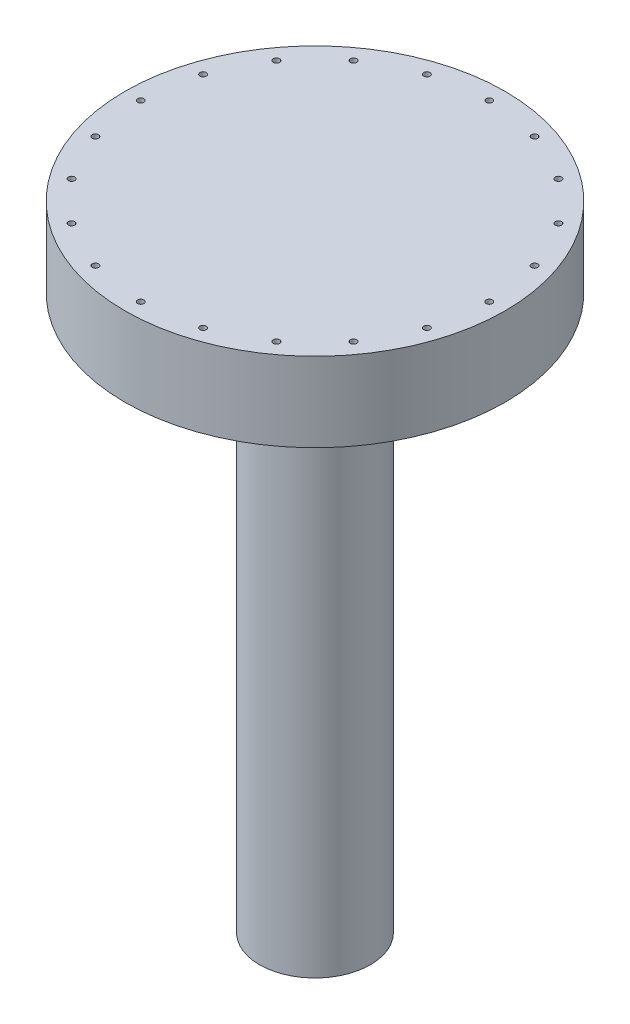
ISO-10303-21;
HEADER;
FILE_DESCRIPTION(('STEP AP214'),'2;1');
FILE_NAME('part.step','',(''),(''),'','','');
FILE_SCHEMA(('AUTOMOTIVE_DESIGN { 1 0 10303 214 1 1 1 1 }'));
ENDSEC;
DATA;
#1=APPLICATION_CONTEXT('core data for automotive mechanical design processes');
#2=APPLICATION_PROTOCOL_DEFINITION('international standard','automotive_design',2000,#1);
#3=PRODUCT_CONTEXT('',#1,'mechanical');
#4=PRODUCT('Part','Part','',(#3));
#5=PRODUCT_RELATED_PRODUCT_CATEGORY('part','',(#4));
#6=PRODUCT_DEFINITION_FORMATION('','',#4);
#7=PRODUCT_DEFINITION_CONTEXT('part definition',#1,'design');
#8=PRODUCT_DEFINITION('design','',#6,#7);
#9=PRODUCT_DEFINITION_SHAPE('','',#8);
#10=(LENGTH_UNIT() NAMED_UNIT(*) SI_UNIT(.MILLI.,.METRE.));
#11=(NAMED_UNIT(*) PLANE_ANGLE_UNIT() SI_UNIT($,.RADIAN.));
#12=(NAMED_UNIT(*) SI_UNIT($,.STERADIAN.) SOLID_ANGLE_UNIT());
#13=UNCERTAINTY_MEASURE_WITH_UNIT(LENGTH_MEASURE(1.E-05),#10,'distance_accuracy_value','');
#14=(GEOMETRIC_REPRESENTATION_CONTEXT(3) GLOBAL_UNCERTAINTY_ASSIGNED_CONTEXT((#13)) GLOBAL_UNIT_ASSIGNED_CONTEXT((#10,
#11,#12)) REPRESENTATION_CONTEXT('',''));
#15=CARTESIAN_POINT('',(0.,0.,0.));
#16=DIRECTION('',(0.,0.,1.));
#17=DIRECTION('',(1.,0.,0.));
#18=AXIS2_PLACEMENT_3D('',#15,#16,#17);
#19=CARTESIAN_POINT('',(0.,35.,0.));
#20=DIRECTION('',(0.,-1.,0.));
#21=DIRECTION('',(0.,0.,-1.));
#22=AXIS2_PLACEMENT_3D('',#19,#20,#21);
#23=CYLINDRICAL_SURFACE('',#22,3.5);
#24=CARTESIAN_POINT('',(0.,35.,0.));
#25=DIRECTION('',(0.,1.,0.));
#26=DIRECTION('',(0.,0.,1.));
#27=AXIS2_PLACEMENT_3D('',#24,#25,#26);
#28=CIRCLE('',#27,3.5);
#29=CARTESIAN_POINT('',(0.,35.,3.5));
#30=VERTEX_POINT('',#29);
#31=EDGE_CURVE('E10',#30,#30,#28,.T.);
#32=ORIENTED_EDGE('',*,*,#31,.F.);
#33=EDGE_LOOP('',(#32));
#34=FACE_BOUND('',#33,.T.);
#35=CARTESIAN_POINT('',(0.,0.,0.));
#36=DIRECTION('',(0.,1.,0.));
#37=DIRECTION('',(0.,0.,1.));
#38=AXIS2_PLACEMENT_3D('',#35,#36,#37);
#39=CIRCLE('',#38,3.5);
#40=CARTESIAN_POINT('',(0.,0.,3.5));
#41=VERTEX_POINT('',#40);
#42=EDGE_CURVE('E34',#41,#41,#39,.T.);
#43=ORIENTED_EDGE('',*,*,#42,.T.);
#44=EDGE_LOOP('',(#43));
#45=FACE_BOUND('',#44,.T.);
#46=ADVANCED_FACE('F31',(#34,#45),#23,.T.);
#47=CARTESIAN_POINT('',(0.,0.,0.));
#48=DIRECTION('',(0.,1.,0.));
#49=DIRECTION('',(0.,0.,1.));
#50=AXIS2_PLACEMENT_3D('',#47,#48,#49);
#51=PLANE('',#50);
#52=ORIENTED_EDGE('',*,*,#42,.F.);
#53=EDGE_LOOP('',(#52));
#54=FACE_BOUND('',#53,.T.);
#55=ADVANCED_FACE('F226',(#54),#51,.F.);
#56=CARTESIAN_POINT('',(0.,40.,0.));
#57=DIRECTION('',(0.,-1.,0.));
#58=DIRECTION('',(0.,0.,-1.));
#59=AXIS2_PLACEMENT_3D('',#56,#57,#58);
#60=CYLINDRICAL_SURFACE('',#59,12.);
#61=CARTESIAN_POINT('',(0.,40.,0.));
#62=DIRECTION('',(0.,1.,0.));
#63=DIRECTION('',(0.,0.,1.));
#64=AXIS2_PLACEMENT_3D('',#61,#62,#63);
#65=CIRCLE('',#64,12.);
#66=CARTESIAN_POINT('',(0.,40.,12.));
#67=VERTEX_POINT('',#66);
#68=EDGE_CURVE('E41',#67,#67,#65,.T.);
#69=ORIENTED_EDGE('',*,*,#68,.F.);
#70=EDGE_LOOP('',(#69));
#71=FACE_BOUND('',#70,.T.);
#72=CARTESIAN_POINT('',(0.,35.,0.));
#73=DIRECTION('',(0.,1.,0.));
#74=DIRECTION('',(0.,0.,1.));
#75=AXIS2_PLACEMENT_3D('',#72,#73,#74);
#76=CIRCLE('',#75,12.);
#77=CARTESIAN_POINT('',(0.,35.,12.));
#78=VERTEX_POINT('',#77);
#79=EDGE_CURVE('E43',#78,#78,#76,.T.);
#80=ORIENTED_EDGE('',*,*,#79,.T.);
#81=EDGE_LOOP('',(#80));
#82=FACE_BOUND('',#81,.T.);
#83=ADVANCED_FACE('F182',(#71,#82),#60,.T.);
#84=CARTESIAN_POINT('',(0.,40.,0.));
#85=DIRECTION('',(0.,1.,0.));
#86=DIRECTION('',(0.,0.,1.));
#87=AXIS2_PLACEMENT_3D('',#84,#85,#86);
#88=PLANE('',#87);
#89=CARTESIAN_POINT('',(-6.46563777521722,40.,-8.89918693812442));
#90=DIRECTION('',(0.,1.,0.));
#91=DIRECTION('',(0.587785252292474,0.,0.809016994374947));
#92=AXIS2_PLACEMENT_3D('',#89,#90,#91);
#93=CIRCLE('',#92,0.2);
#94=CARTESIAN_POINT('',(-6.34808072475872,40.,-8.73738353924943));
#95=VERTEX_POINT('',#94);
#96=EDGE_CURVE('E163',#95,#95,#93,.T.);
#97=ORIENTED_EDGE('',*,*,#96,.F.);
#98=EDGE_LOOP('',(#97));
#99=FACE_BOUND('',#98,.T.);
#100=CARTESIAN_POINT('',(-8.89918693812444,40.,-6.46563777521718));
#101=DIRECTION('',(0.,1.,0.));
#102=DIRECTION('',(0.809016994374949,0.,0.587785252292471));
#103=AXIS2_PLACEMENT_3D('',#100,#101,#102);
#104=CIRCLE('',#103,0.2);
#105=CARTESIAN_POINT('',(-8.73738353924944,40.,-6.34808072475869));
#106=VERTEX_POINT('',#105);
#107=EDGE_CURVE('E157',#106,#106,#104,.T.);
#108=ORIENTED_EDGE('',*,*,#107,.F.);
#109=EDGE_LOOP('',(#108));
#110=FACE_BOUND('',#109,.T.);
#111=CARTESIAN_POINT('',(-10.4616216792467,40.,-3.39918693812439));
#112=DIRECTION('',(0.,1.,0.));
#113=DIRECTION('',(0.951056516295155,0.,0.309016994374945));
#114=AXIS2_PLACEMENT_3D('',#111,#112,#113);
#115=CIRCLE('',#114,0.2);
#116=CARTESIAN_POINT('',(-10.2714103759877,40.,-3.3373835392494));
#117=VERTEX_POINT('',#116);
#118=EDGE_CURVE('E151',#117,#117,#115,.T.);
#119=ORIENTED_EDGE('',*,*,#118,.F.);
#120=EDGE_LOOP('',(#119));
#121=FACE_BOUND('',#120,.T.);
#122=CARTESIAN_POINT('',(-11.,40.,0.));
#123=DIRECTION('',(0.,1.,0.));
#124=DIRECTION('',(1.,0.,0.));
#125=AXIS2_PLACEMENT_3D('',#122,#123,#124);
#126=CIRCLE('',#125,0.2);
#127=CARTESIAN_POINT('',(-10.8,40.,0.));
#128=VERTEX_POINT('',#127);
#129=EDGE_CURVE('E145',#128,#128,#126,.T.);
#130=ORIENTED_EDGE('',*,*,#129,.F.);
#131=EDGE_LOOP('',(#130));
#132=FACE_BOUND('',#131,.T.);
#133=CARTESIAN_POINT('',(-10.4616216792467,40.,3.39918693812447));
#134=DIRECTION('',(0.,1.,0.));
#135=DIRECTION('',(0.951056516295152,0.,-0.309016994374952));
#136=AXIS2_PLACEMENT_3D('',#133,#134,#135);
#137=CIRCLE('',#136,0.2);
#138=CARTESIAN_POINT('',(-10.2714103759876,40.,3.33738353924948));
#139=VERTEX_POINT('',#138);
#140=EDGE_CURVE('E139',#139,#139,#137,.T.);
#141=ORIENTED_EDGE('',*,*,#140,.F.);
#142=EDGE_LOOP('',(#141));
#143=FACE_BOUND('',#142,.T.);
#144=CARTESIAN_POINT('',(-8.89918693812439,40.,6.46563777521725));
#145=DIRECTION('',(0.,1.,0.));
#146=DIRECTION('',(0.809016994374945,0.,-0.587785252292477));
#147=AXIS2_PLACEMENT_3D('',#144,#145,#146);
#148=CIRCLE('',#147,0.2);
#149=CARTESIAN_POINT('',(-8.7373835392494,40.,6.34808072475875));
#150=VERTEX_POINT('',#149);
#151=EDGE_CURVE('E133',#150,#150,#148,.T.);
#152=ORIENTED_EDGE('',*,*,#151,.F.);
#153=EDGE_LOOP('',(#152));
#154=FACE_BOUND('',#153,.T.);
#155=CARTESIAN_POINT('',(-6.46563777521715,40.,8.89918693812446));
#156=DIRECTION('',(0.,1.,0.));
#157=DIRECTION('',(0.587785252292469,0.,-0.809016994374951));
#158=AXIS2_PLACEMENT_3D('',#155,#156,#157);
#159=CIRCLE('',#158,0.2);
#160=CARTESIAN_POINT('',(-6.34808072475866,40.,8.73738353924947));
#161=VERTEX_POINT('',#160);
#162=EDGE_CURVE('E127',#161,#161,#159,.T.);
#163=ORIENTED_EDGE('',*,*,#162,.F.);
#164=EDGE_LOOP('',(#163));
#165=FACE_BOUND('',#164,.T.);
#166=CARTESIAN_POINT('',(-3.39918693812435,40.,10.4616216792467));
#167=DIRECTION('',(0.,1.,0.));
#168=DIRECTION('',(0.309016994374941,0.,-0.951056516295156));
#169=AXIS2_PLACEMENT_3D('',#166,#167,#168);
#170=CIRCLE('',#169,0.2);
#171=CARTESIAN_POINT('',(-3.33738353924936,40.,10.2714103759877));
#172=VERTEX_POINT('',#171);
#173=EDGE_CURVE('E121',#172,#172,#170,.T.);
#174=ORIENTED_EDGE('',*,*,#173,.F.);
#175=EDGE_LOOP('',(#174));
#176=FACE_BOUND('',#175,.T.);
#177=CARTESIAN_POINT('',(0.,40.,11.));
#178=DIRECTION('',(0.,1.,0.));
#179=DIRECTION('',(0.,0.,-1.));
#180=AXIS2_PLACEMENT_3D('',#177,#178,#179);
#181=CIRCLE('',#180,0.2);
#182=CARTESIAN_POINT('',(0.,40.,10.8));
#183=VERTEX_POINT('',#182);
#184=EDGE_CURVE('E115',#183,#183,#181,.T.);
#185=ORIENTED_EDGE('',*,*,#184,.F.);
#186=EDGE_LOOP('',(#185));
#187=FACE_BOUND('',#186,.T.);
#188=CARTESIAN_POINT('',(3.3991869381245,40.,10.4616216792467));
#189=DIRECTION('',(0.,1.,0.));
#190=DIRECTION('',(-0.309016994374955,0.,-0.951056516295151));
#191=AXIS2_PLACEMENT_3D('',#188,#189,#190);
#192=CIRCLE('',#191,0.2);
#193=CARTESIAN_POINT('',(3.33738353924951,40.,10.2714103759876));
#194=VERTEX_POINT('',#193);
#195=EDGE_CURVE('E109',#194,#194,#192,.T.);
#196=ORIENTED_EDGE('',*,*,#195,.F.);
#197=EDGE_LOOP('',(#196));
#198=FACE_BOUND('',#197,.T.);
#199=CARTESIAN_POINT('',(6.46563777521728,40.,8.89918693812436));
#200=DIRECTION('',(0.,1.,0.));
#201=DIRECTION('',(-0.58778525229248,0.,-0.809016994374942));
#202=AXIS2_PLACEMENT_3D('',#199,#200,#201);
#203=CIRCLE('',#202,0.2);
#204=CARTESIAN_POINT('',(6.34808072475879,40.,8.73738353924938));
#205=VERTEX_POINT('',#204);
#206=EDGE_CURVE('E103',#205,#205,#203,.T.);
#207=ORIENTED_EDGE('',*,*,#206,.F.);
#208=EDGE_LOOP('',(#207));
#209=FACE_BOUND('',#208,.T.);
#210=CARTESIAN_POINT('',(8.89918693812449,40.,6.46563777521712));
#211=DIRECTION('',(0.,1.,0.));
#212=DIRECTION('',(-0.809016994374953,0.,-0.587785252292465));
#213=AXIS2_PLACEMENT_3D('',#210,#211,#212);
#214=CIRCLE('',#213,0.2);
#215=CARTESIAN_POINT('',(8.73738353924949,40.,6.34808072475863));
#216=VERTEX_POINT('',#215);
#217=EDGE_CURVE('E97',#216,#216,#214,.T.);
#218=ORIENTED_EDGE('',*,*,#217,.F.);
#219=EDGE_LOOP('',(#218));
#220=FACE_BOUND('',#219,.T.);
#221=CARTESIAN_POINT('',(10.4616216792467,40.,3.39918693812432));
#222=DIRECTION('',(0.,1.,0.));
#223=DIRECTION('',(-0.951056516295157,0.,-0.309016994374938));
#224=AXIS2_PLACEMENT_3D('',#221,#222,#223);
#225=CIRCLE('',#224,0.2);
#226=CARTESIAN_POINT('',(10.2714103759877,40.,3.33738353924933));
#227=VERTEX_POINT('',#226);
#228=EDGE_CURVE('E91',#227,#227,#225,.T.);
#229=ORIENTED_EDGE('',*,*,#228,.F.);
#230=EDGE_LOOP('',(#229));
#231=FACE_BOUND('',#230,.T.);
#232=CARTESIAN_POINT('',(11.,40.,-1.15218884181823E-13));
#233=DIRECTION('',(0.,1.,0.));
#234=DIRECTION('',(-1.,0.,0.));
#235=AXIS2_PLACEMENT_3D('',#232,#233,#234);
#236=CIRCLE('',#235,0.2);
#237=CARTESIAN_POINT('',(10.8,40.,-1.13123995378518E-13));
#238=VERTEX_POINT('',#237);
#239=EDGE_CURVE('E85',#238,#238,#236,.T.);
#240=ORIENTED_EDGE('',*,*,#239,.F.);
#241=EDGE_LOOP('',(#240));
#242=FACE_BOUND('',#241,.T.);
#243=CARTESIAN_POINT('',(10.4616216792467,40.,-3.39918693812454));
#244=DIRECTION('',(0.,1.,0.));
#245=DIRECTION('',(-0.95105651629515,0.,0.309016994374958));
#246=AXIS2_PLACEMENT_3D('',#243,#244,#245);
#247=CIRCLE('',#246,0.2);
#248=CARTESIAN_POINT('',(10.2714103759876,40.,-3.33738353924955));
#249=VERTEX_POINT('',#248);
#250=EDGE_CURVE('E79',#249,#249,#247,.T.);
#251=ORIENTED_EDGE('',*,*,#250,.F.);
#252=EDGE_LOOP('',(#251));
#253=FACE_BOUND('',#252,.T.);
#254=CARTESIAN_POINT('',(8.89918693812434,40.,-6.46563777521731));
#255=DIRECTION('',(0.,1.,0.));
#256=DIRECTION('',(-0.80901699437494,0.,0.587785252292483));
#257=AXIS2_PLACEMENT_3D('',#254,#255,#256);
#258=CIRCLE('',#257,0.2);
#259=CARTESIAN_POINT('',(8.73738353924935,40.,-6.34808072475882));
#260=VERTEX_POINT('',#259);
#261=EDGE_CURVE('E73',#260,#260,#258,.T.);
#262=ORIENTED_EDGE('',*,*,#261,.F.);
#263=EDGE_LOOP('',(#262));
#264=FACE_BOUND('',#263,.T.);
#265=CARTESIAN_POINT('',(6.46563777521709,40.,-8.8991869381245));
#266=DIRECTION('',(0.,1.,0.));
#267=DIRECTION('',(-0.587785252292462,0.,0.809016994374955));
#268=AXIS2_PLACEMENT_3D('',#265,#266,#267);
#269=CIRCLE('',#268,0.2);
#270=CARTESIAN_POINT('',(6.34808072475859,40.,-8.73738353924951));
#271=VERTEX_POINT('',#270);
#272=EDGE_CURVE('E67',#271,#271,#269,.T.);
#273=ORIENTED_EDGE('',*,*,#272,.F.);
#274=EDGE_LOOP('',(#273));
#275=FACE_BOUND('',#274,.T.);
#276=CARTESIAN_POINT('',(3.39918693812428,40.,-10.4616216792467));
#277=DIRECTION('',(0.,1.,0.));
#278=DIRECTION('',(-0.309016994374935,0.,0.951056516295158));
#279=AXIS2_PLACEMENT_3D('',#276,#277,#278);
#280=CIRCLE('',#279,0.2);
#281=CARTESIAN_POINT('',(3.3373835392493,40.,-10.2714103759877));
#282=VERTEX_POINT('',#281);
#283=EDGE_CURVE('E61',#282,#282,#280,.T.);
#284=ORIENTED_EDGE('',*,*,#283,.F.);
#285=EDGE_LOOP('',(#284));
#286=FACE_BOUND('',#285,.T.);
#287=CARTESIAN_POINT('',(-3.39918693812443,40.,-10.4616216792467));
#288=DIRECTION('',(0.,1.,0.));
#289=DIRECTION('',(0.309016994374948,0.,0.951056516295154));
#290=AXIS2_PLACEMENT_3D('',#287,#288,#289);
#291=CIRCLE('',#290,0.2);
#292=CARTESIAN_POINT('',(-3.33738353924944,40.,-10.2714103759877));
#293=VERTEX_POINT('',#292);
#294=EDGE_CURVE('E55',#293,#293,#291,.T.);
#295=ORIENTED_EDGE('',*,*,#294,.F.);
#296=EDGE_LOOP('',(#295));
#297=FACE_BOUND('',#296,.T.);
#298=CARTESIAN_POINT('',(0.,40.,-11.));
#299=DIRECTION('',(0.,1.,0.));
#300=DIRECTION('',(0.,0.,1.));
#301=AXIS2_PLACEMENT_3D('',#298,#299,#300);
#302=CIRCLE('',#301,0.2);
#303=CARTESIAN_POINT('',(0.,40.,-10.8));
#304=VERTEX_POINT('',#303);
#305=EDGE_CURVE('E49',#304,#304,#302,.T.);
#306=ORIENTED_EDGE('',*,*,#305,.F.);
#307=EDGE_LOOP('',(#306));
#308=FACE_BOUND('',#307,.T.);
#309=ORIENTED_EDGE('',*,*,#68,.T.);
#310=EDGE_LOOP('',(#309));
#311=FACE_BOUND('',#310,.T.);
#312=ADVANCED_FACE('F179',(#99,#110,#121,#132,#143,#154,#165,#176,#187,#198,#209,#220,#231,#242,
#253,#264,#275,#286,#297,#308,#311),#88,.T.);
#313=CARTESIAN_POINT('',(0.,35.,0.));
#314=DIRECTION('',(0.,1.,0.));
#315=DIRECTION('',(0.,0.,1.));
#316=AXIS2_PLACEMENT_3D('',#313,#314,#315);
#317=PLANE('',#316);
#318=CARTESIAN_POINT('',(-6.46563777521722,35.,-8.89918693812442));
#319=DIRECTION('',(0.,1.,0.));
#320=DIRECTION('',(0.587785252292474,0.,0.809016994374947));
#321=AXIS2_PLACEMENT_3D('',#318,#319,#320);
#322=CIRCLE('',#321,0.2);
#323=CARTESIAN_POINT('',(-6.34808072475872,35.,-8.73738353924943));
#324=VERTEX_POINT('',#323);
#325=EDGE_CURVE('E58',#324,#324,#322,.T.);
#326=ORIENTED_EDGE('',*,*,#325,.T.);
#327=EDGE_LOOP('',(#326));
#328=FACE_BOUND('',#327,.T.);
#329=CARTESIAN_POINT('',(-8.89918693812444,35.,-6.46563777521718));
#330=DIRECTION('',(0.,1.,0.));
#331=DIRECTION('',(0.809016994374949,0.,0.587785252292471));
#332=AXIS2_PLACEMENT_3D('',#329,#330,#331);
#333=CIRCLE('',#332,0.2);
#334=CARTESIAN_POINT('',(-8.73738353924944,35.,-6.34808072475869));
#335=VERTEX_POINT('',#334);
#336=EDGE_CURVE('E160',#335,#335,#333,.T.);
#337=ORIENTED_EDGE('',*,*,#336,.T.);
#338=EDGE_LOOP('',(#337));
#339=FACE_BOUND('',#338,.T.);
#340=CARTESIAN_POINT('',(-10.4616216792467,35.,-3.39918693812439));
#341=DIRECTION('',(0.,1.,0.));
#342=DIRECTION('',(0.951056516295155,0.,0.309016994374945));
#343=AXIS2_PLACEMENT_3D('',#340,#341,#342);
#344=CIRCLE('',#343,0.2);
#345=CARTESIAN_POINT('',(-10.2714103759877,35.,-3.3373835392494));
#346=VERTEX_POINT('',#345);
#347=EDGE_CURVE('E154',#346,#346,#344,.T.);
#348=ORIENTED_EDGE('',*,*,#347,.T.);
#349=EDGE_LOOP('',(#348));
#350=FACE_BOUND('',#349,.T.);
#351=CARTESIAN_POINT('',(-11.,35.,0.));
#352=DIRECTION('',(0.,1.,0.));
#353=DIRECTION('',(1.,0.,0.));
#354=AXIS2_PLACEMENT_3D('',#351,#352,#353);
#355=CIRCLE('',#354,0.2);
#356=CARTESIAN_POINT('',(-10.8,35.,0.));
#357=VERTEX_POINT('',#356);
#358=EDGE_CURVE('E148',#357,#357,#355,.T.);
#359=ORIENTED_EDGE('',*,*,#358,.T.);
#360=EDGE_LOOP('',(#359));
#361=FACE_BOUND('',#360,.T.);
#362=CARTESIAN_POINT('',(-10.4616216792467,35.,3.39918693812447));
#363=DIRECTION('',(0.,1.,0.));
#364=DIRECTION('',(0.951056516295152,0.,-0.309016994374952));
#365=AXIS2_PLACEMENT_3D('',#362,#363,#364);
#366=CIRCLE('',#365,0.2);
#367=CARTESIAN_POINT('',(-10.2714103759876,35.,3.33738353924948));
#368=VERTEX_POINT('',#367);
#369=EDGE_CURVE('E142',#368,#368,#366,.T.);
#370=ORIENTED_EDGE('',*,*,#369,.T.);
#371=EDGE_LOOP('',(#370));
#372=FACE_BOUND('',#371,.T.);
#373=CARTESIAN_POINT('',(-8.89918693812439,35.,6.46563777521725));
#374=DIRECTION('',(0.,1.,0.));
#375=DIRECTION('',(0.809016994374945,0.,-0.587785252292477));
#376=AXIS2_PLACEMENT_3D('',#373,#374,#375);
#377=CIRCLE('',#376,0.2);
#378=CARTESIAN_POINT('',(-8.7373835392494,35.,6.34808072475875));
#379=VERTEX_POINT('',#378);
#380=EDGE_CURVE('E136',#379,#379,#377,.T.);
#381=ORIENTED_EDGE('',*,*,#380,.T.);
#382=EDGE_LOOP('',(#381));
#383=FACE_BOUND('',#382,.T.);
#384=CARTESIAN_POINT('',(-6.46563777521715,35.,8.89918693812446));
#385=DIRECTION('',(0.,1.,0.));
#386=DIRECTION('',(0.587785252292469,0.,-0.809016994374951));
#387=AXIS2_PLACEMENT_3D('',#384,#385,#386);
#388=CIRCLE('',#387,0.2);
#389=CARTESIAN_POINT('',(-6.34808072475866,35.,8.73738353924947));
#390=VERTEX_POINT('',#389);
#391=EDGE_CURVE('E130',#390,#390,#388,.T.);
#392=ORIENTED_EDGE('',*,*,#391,.T.);
#393=EDGE_LOOP('',(#392));
#394=FACE_BOUND('',#393,.T.);
#395=CARTESIAN_POINT('',(-3.39918693812435,35.,10.4616216792467));
#396=DIRECTION('',(0.,1.,0.));
#397=DIRECTION('',(0.309016994374941,0.,-0.951056516295156));
#398=AXIS2_PLACEMENT_3D('',#395,#396,#397);
#399=CIRCLE('',#398,0.2);
#400=CARTESIAN_POINT('',(-3.33738353924936,35.,10.2714103759877));
#401=VERTEX_POINT('',#400);
#402=EDGE_CURVE('E124',#401,#401,#399,.T.);
#403=ORIENTED_EDGE('',*,*,#402,.T.);
#404=EDGE_LOOP('',(#403));
#405=FACE_BOUND('',#404,.T.);
#406=CARTESIAN_POINT('',(0.,35.,11.));
#407=DIRECTION('',(0.,1.,0.));
#408=DIRECTION('',(0.,0.,-1.));
#409=AXIS2_PLACEMENT_3D('',#406,#407,#408);
#410=CIRCLE('',#409,0.2);
#411=CARTESIAN_POINT('',(0.,35.,10.8));
#412=VERTEX_POINT('',#411);
#413=EDGE_CURVE('E118',#412,#412,#410,.T.);
#414=ORIENTED_EDGE('',*,*,#413,.T.);
#415=EDGE_LOOP('',(#414));
#416=FACE_BOUND('',#415,.T.);
#417=CARTESIAN_POINT('',(3.3991869381245,35.,10.4616216792467));
#418=DIRECTION('',(0.,1.,0.));
#419=DIRECTION('',(-0.309016994374955,0.,-0.951056516295151));
#420=AXIS2_PLACEMENT_3D('',#417,#418,#419);
#421=CIRCLE('',#420,0.2);
#422=CARTESIAN_POINT('',(3.33738353924951,35.,10.2714103759876));
#423=VERTEX_POINT('',#422);
#424=EDGE_CURVE('E112',#423,#423,#421,.T.);
#425=ORIENTED_EDGE('',*,*,#424,.T.);
#426=EDGE_LOOP('',(#425));
#427=FACE_BOUND('',#426,.T.);
#428=CARTESIAN_POINT('',(6.46563777521728,35.,8.89918693812436));
#429=DIRECTION('',(0.,1.,0.));
#430=DIRECTION('',(-0.58778525229248,0.,-0.809016994374942));
#431=AXIS2_PLACEMENT_3D('',#428,#429,#430);
#432=CIRCLE('',#431,0.2);
#433=CARTESIAN_POINT('',(6.34808072475879,35.,8.73738353924938));
#434=VERTEX_POINT('',#433);
#435=EDGE_CURVE('E106',#434,#434,#432,.T.);
#436=ORIENTED_EDGE('',*,*,#435,.T.);
#437=EDGE_LOOP('',(#436));
#438=FACE_BOUND('',#437,.T.);
#439=CARTESIAN_POINT('',(8.89918693812449,35.,6.46563777521712));
#440=DIRECTION('',(0.,1.,0.));
#441=DIRECTION('',(-0.809016994374953,0.,-0.587785252292465));
#442=AXIS2_PLACEMENT_3D('',#439,#440,#441);
#443=CIRCLE('',#442,0.2);
#444=CARTESIAN_POINT('',(8.73738353924949,35.,6.34808072475863));
#445=VERTEX_POINT('',#444);
#446=EDGE_CURVE('E100',#445,#445,#443,.T.);
#447=ORIENTED_EDGE('',*,*,#446,.T.);
#448=EDGE_LOOP('',(#447));
#449=FACE_BOUND('',#448,.T.);
#450=CARTESIAN_POINT('',(10.4616216792467,35.,3.39918693812432));
#451=DIRECTION('',(0.,1.,0.));
#452=DIRECTION('',(-0.951056516295157,0.,-0.309016994374938));
#453=AXIS2_PLACEMENT_3D('',#450,#451,#452);
#454=CIRCLE('',#453,0.2);
#455=CARTESIAN_POINT('',(10.2714103759877,35.,3.33738353924933));
#456=VERTEX_POINT('',#455);
#457=EDGE_CURVE('E94',#456,#456,#454,.T.);
#458=ORIENTED_EDGE('',*,*,#457,.T.);
#459=EDGE_LOOP('',(#458));
#460=FACE_BOUND('',#459,.T.);
#461=CARTESIAN_POINT('',(11.,35.,-1.15218884181823E-13));
#462=DIRECTION('',(0.,1.,0.));
#463=DIRECTION('',(-1.,0.,0.));
#464=AXIS2_PLACEMENT_3D('',#461,#462,#463);
#465=CIRCLE('',#464,0.2);
#466=CARTESIAN_POINT('',(10.8,35.,-1.13123995378518E-13));
#467=VERTEX_POINT('',#466);
#468=EDGE_CURVE('E88',#467,#467,#465,.T.);
#469=ORIENTED_EDGE('',*,*,#468,.T.);
#470=EDGE_LOOP('',(#469));
#471=FACE_BOUND('',#470,.T.);
#472=CARTESIAN_POINT('',(10.4616216792467,35.,-3.39918693812454));
#473=DIRECTION('',(0.,1.,0.));
#474=DIRECTION('',(-0.95105651629515,0.,0.309016994374958));
#475=AXIS2_PLACEMENT_3D('',#472,#473,#474);
#476=CIRCLE('',#475,0.2);
#477=CARTESIAN_POINT('',(10.2714103759876,35.,-3.33738353924955));
#478=VERTEX_POINT('',#477);
#479=EDGE_CURVE('E82',#478,#478,#476,.T.);
#480=ORIENTED_EDGE('',*,*,#479,.T.);
#481=EDGE_LOOP('',(#480));
#482=FACE_BOUND('',#481,.T.);
#483=CARTESIAN_POINT('',(8.89918693812434,35.,-6.46563777521731));
#484=DIRECTION('',(0.,1.,0.));
#485=DIRECTION('',(-0.80901699437494,0.,0.587785252292483));
#486=AXIS2_PLACEMENT_3D('',#483,#484,#485);
#487=CIRCLE('',#486,0.2);
#488=CARTESIAN_POINT('',(8.73738353924935,35.,-6.34808072475882));
#489=VERTEX_POINT('',#488);
#490=EDGE_CURVE('E76',#489,#489,#487,.T.);
#491=ORIENTED_EDGE('',*,*,#490,.T.);
#492=EDGE_LOOP('',(#491));
#493=FACE_BOUND('',#492,.T.);
#494=CARTESIAN_POINT('',(6.46563777521709,35.,-8.8991869381245));
#495=DIRECTION('',(0.,1.,0.));
#496=DIRECTION('',(-0.587785252292462,0.,0.809016994374955));
#497=AXIS2_PLACEMENT_3D('',#494,#495,#496);
#498=CIRCLE('',#497,0.2);
#499=CARTESIAN_POINT('',(6.34808072475859,35.,-8.73738353924951));
#500=VERTEX_POINT('',#499);
#501=EDGE_CURVE('E70',#500,#500,#498,.T.);
#502=ORIENTED_EDGE('',*,*,#501,.T.);
#503=EDGE_LOOP('',(#502));
#504=FACE_BOUND('',#503,.T.);
#505=CARTESIAN_POINT('',(3.39918693812428,35.,-10.4616216792467));
#506=DIRECTION('',(0.,1.,0.));
#507=DIRECTION('',(-0.309016994374935,0.,0.951056516295158));
#508=AXIS2_PLACEMENT_3D('',#505,#506,#507);
#509=CIRCLE('',#508,0.2);
#510=CARTESIAN_POINT('',(3.3373835392493,35.,-10.2714103759877));
#511=VERTEX_POINT('',#510);
#512=EDGE_CURVE('E64',#511,#511,#509,.T.);
#513=ORIENTED_EDGE('',*,*,#512,.T.);
#514=EDGE_LOOP('',(#513));
#515=FACE_BOUND('',#514,.T.);
#516=CARTESIAN_POINT('',(-3.39918693812443,35.,-10.4616216792467));
#517=DIRECTION('',(0.,1.,0.));
#518=DIRECTION('',(0.309016994374948,0.,0.951056516295154));
#519=AXIS2_PLACEMENT_3D('',#516,#517,#518);
#520=CIRCLE('',#519,0.2);
#521=CARTESIAN_POINT('',(-3.33738353924944,35.,-10.2714103759877));
#522=VERTEX_POINT('',#521);
#523=EDGE_CURVE('E52',#522,#522,#520,.T.);
#524=ORIENTED_EDGE('',*,*,#523,.T.);
#525=EDGE_LOOP('',(#524));
#526=FACE_BOUND('',#525,.T.);
#527=CARTESIAN_POINT('',(0.,35.,-11.));
#528=DIRECTION('',(0.,1.,0.));
#529=DIRECTION('',(0.,0.,1.));
#530=AXIS2_PLACEMENT_3D('',#527,#528,#529);
#531=CIRCLE('',#530,0.2);
#532=CARTESIAN_POINT('',(0.,35.,-10.8));
#533=VERTEX_POINT('',#532);
#534=EDGE_CURVE('E46',#533,#533,#531,.T.);
#535=ORIENTED_EDGE('',*,*,#534,.T.);
#536=EDGE_LOOP('',(#535));
#537=FACE_BOUND('',#536,.T.);
#538=ORIENTED_EDGE('',*,*,#31,.T.);
#539=EDGE_LOOP('',(#538));
#540=FACE_BOUND('',#539,.T.);
#541=ORIENTED_EDGE('',*,*,#79,.F.);
#542=EDGE_LOOP('',(#541));
#543=FACE_BOUND('',#542,.T.);
#544=ADVANCED_FACE('F169',(#328,#339,#350,#361,#372,#383,#394,#405,#416,#427,#438,#449,#460,
#471,#482,#493,#504,#515,#526,#537,#540,#543),#317,.F.);
#545=CARTESIAN_POINT('',(0.,35.,-11.));
#546=DIRECTION('',(0.,1.,0.));
#547=DIRECTION('',(0.,0.,1.));
#548=AXIS2_PLACEMENT_3D('',#545,#546,#547);
#549=CYLINDRICAL_SURFACE('',#548,0.2);
#550=ORIENTED_EDGE('',*,*,#534,.F.);
#551=EDGE_LOOP('',(#550));
#552=FACE_BOUND('',#551,.T.);
#553=ORIENTED_EDGE('',*,*,#305,.T.);
#554=EDGE_LOOP('',(#553));
#555=FACE_BOUND('',#554,.T.);
#556=ADVANCED_FACE('F231',(#552,#555),#549,.F.);
#557=CARTESIAN_POINT('',(-3.39918693812443,35.,-10.4616216792467));
#558=DIRECTION('',(0.,1.,0.));
#559=DIRECTION('',(0.,0.,1.));
#560=AXIS2_PLACEMENT_3D('',#557,#558,#559);
#561=CYLINDRICAL_SURFACE('',#560,0.2);
#562=ORIENTED_EDGE('',*,*,#523,.F.);
#563=EDGE_LOOP('',(#562));
#564=FACE_BOUND('',#563,.T.);
#565=ORIENTED_EDGE('',*,*,#294,.T.);
#566=EDGE_LOOP('',(#565));
#567=FACE_BOUND('',#566,.T.);
#568=ADVANCED_FACE('F236',(#564,#567),#561,.F.);
#569=CARTESIAN_POINT('',(3.39918693812428,35.,-10.4616216792467));
#570=DIRECTION('',(0.,1.,0.));
#571=DIRECTION('',(0.,0.,1.));
#572=AXIS2_PLACEMENT_3D('',#569,#570,#571);
#573=CYLINDRICAL_SURFACE('',#572,0.2);
#574=ORIENTED_EDGE('',*,*,#512,.F.);
#575=EDGE_LOOP('',(#574));
#576=FACE_BOUND('',#575,.T.);
#577=ORIENTED_EDGE('',*,*,#283,.T.);
#578=EDGE_LOOP('',(#577));
#579=FACE_BOUND('',#578,.T.);
#580=ADVANCED_FACE('F273',(#576,#579),#573,.F.);
#581=CARTESIAN_POINT('',(6.46563777521709,35.,-8.8991869381245));
#582=DIRECTION('',(0.,1.,0.));
#583=DIRECTION('',(0.,0.,1.));
#584=AXIS2_PLACEMENT_3D('',#581,#582,#583);
#585=CYLINDRICAL_SURFACE('',#584,0.2);
#586=ORIENTED_EDGE('',*,*,#501,.F.);
#587=EDGE_LOOP('',(#586));
#588=FACE_BOUND('',#587,.T.);
#589=ORIENTED_EDGE('',*,*,#272,.T.);
#590=EDGE_LOOP('',(#589));
#591=FACE_BOUND('',#590,.T.);
#592=ADVANCED_FACE('F283',(#588,#591),#585,.F.);
#593=CARTESIAN_POINT('',(8.89918693812434,35.,-6.46563777521731));
#594=DIRECTION('',(0.,1.,0.));
#595=DIRECTION('',(0.,0.,1.));
#596=AXIS2_PLACEMENT_3D('',#593,#594,#595);
#597=CYLINDRICAL_SURFACE('',#596,0.2);
#598=ORIENTED_EDGE('',*,*,#490,.F.);
#599=EDGE_LOOP('',(#598));
#600=FACE_BOUND('',#599,.T.);
#601=ORIENTED_EDGE('',*,*,#261,.T.);
#602=EDGE_LOOP('',(#601));
#603=FACE_BOUND('',#602,.T.);
#604=ADVANCED_FACE('F293',(#600,#603),#597,.F.);
#605=CARTESIAN_POINT('',(10.4616216792467,35.,-3.39918693812454));
#606=DIRECTION('',(0.,1.,0.));
#607=DIRECTION('',(0.,0.,1.));
#608=AXIS2_PLACEMENT_3D('',#605,#606,#607);
#609=CYLINDRICAL_SURFACE('',#608,0.2);
#610=ORIENTED_EDGE('',*,*,#479,.F.);
#611=EDGE_LOOP('',(#610));
#612=FACE_BOUND('',#611,.T.);
#613=ORIENTED_EDGE('',*,*,#250,.T.);
#614=EDGE_LOOP('',(#613));
#615=FACE_BOUND('',#614,.T.);
#616=ADVANCED_FACE('F303',(#612,#615),#609,.F.);
#617=CARTESIAN_POINT('',(11.,35.,-1.15218884181823E-13));
#618=DIRECTION('',(0.,1.,0.));
#619=DIRECTION('',(0.,0.,1.));
#620=AXIS2_PLACEMENT_3D('',#617,#618,#619);
#621=CYLINDRICAL_SURFACE('',#620,0.2);
#622=ORIENTED_EDGE('',*,*,#468,.F.);
#623=EDGE_LOOP('',(#622));
#624=FACE_BOUND('',#623,.T.);
#625=ORIENTED_EDGE('',*,*,#239,.T.);
#626=EDGE_LOOP('',(#625));
#627=FACE_BOUND('',#626,.T.);
#628=ADVANCED_FACE('F313',(#624,#627),#621,.F.);
#629=CARTESIAN_POINT('',(10.4616216792467,35.,3.39918693812432));
#630=DIRECTION('',(0.,1.,0.));
#631=DIRECTION('',(0.,0.,1.));
#632=AXIS2_PLACEMENT_3D('',#629,#630,#631);
#633=CYLINDRICAL_SURFACE('',#632,0.2);
#634=ORIENTED_EDGE('',*,*,#457,.F.);
#635=EDGE_LOOP('',(#634));
#636=FACE_BOUND('',#635,.T.);
#637=ORIENTED_EDGE('',*,*,#228,.T.);
#638=EDGE_LOOP('',(#637));
#639=FACE_BOUND('',#638,.T.);
#640=ADVANCED_FACE('F323',(#636,#639),#633,.F.);
#641=CARTESIAN_POINT('',(8.89918693812449,35.,6.46563777521712));
#642=DIRECTION('',(0.,1.,0.));
#643=DIRECTION('',(0.,0.,1.));
#644=AXIS2_PLACEMENT_3D('',#641,#642,#643);
#645=CYLINDRICAL_SURFACE('',#644,0.2);
#646=ORIENTED_EDGE('',*,*,#446,.F.);
#647=EDGE_LOOP('',(#646));
#648=FACE_BOUND('',#647,.T.);
#649=ORIENTED_EDGE('',*,*,#217,.T.);
#650=EDGE_LOOP('',(#649));
#651=FACE_BOUND('',#650,.T.);
#652=ADVANCED_FACE('F333',(#648,#651),#645,.F.);
#653=CARTESIAN_POINT('',(6.46563777521728,35.,8.89918693812436));
#654=DIRECTION('',(0.,1.,0.));
#655=DIRECTION('',(0.,0.,1.));
#656=AXIS2_PLACEMENT_3D('',#653,#654,#655);
#657=CYLINDRICAL_SURFACE('',#656,0.2);
#658=ORIENTED_EDGE('',*,*,#435,.F.);
#659=EDGE_LOOP('',(#658));
#660=FACE_BOUND('',#659,.T.);
#661=ORIENTED_EDGE('',*,*,#206,.T.);
#662=EDGE_LOOP('',(#661));
#663=FACE_BOUND('',#662,.T.);
#664=ADVANCED_FACE('F343',(#660,#663),#657,.F.);
#665=CARTESIAN_POINT('',(3.3991869381245,35.,10.4616216792467));
#666=DIRECTION('',(0.,1.,0.));
#667=DIRECTION('',(0.,0.,1.));
#668=AXIS2_PLACEMENT_3D('',#665,#666,#667);
#669=CYLINDRICAL_SURFACE('',#668,0.2);
#670=ORIENTED_EDGE('',*,*,#424,.F.);
#671=EDGE_LOOP('',(#670));
#672=FACE_BOUND('',#671,.T.);
#673=ORIENTED_EDGE('',*,*,#195,.T.);
#674=EDGE_LOOP('',(#673));
#675=FACE_BOUND('',#674,.T.);
#676=ADVANCED_FACE('F353',(#672,#675),#669,.F.);
#677=CARTESIAN_POINT('',(0.,35.,11.));
#678=DIRECTION('',(0.,1.,0.));
#679=DIRECTION('',(0.,0.,1.));
#680=AXIS2_PLACEMENT_3D('',#677,#678,#679);
#681=CYLINDRICAL_SURFACE('',#680,0.2);
#682=ORIENTED_EDGE('',*,*,#413,.F.);
#683=EDGE_LOOP('',(#682));
#684=FACE_BOUND('',#683,.T.);
#685=ORIENTED_EDGE('',*,*,#184,.T.);
#686=EDGE_LOOP('',(#685));
#687=FACE_BOUND('',#686,.T.);
#688=ADVANCED_FACE('F363',(#684,#687),#681,.F.);
#689=CARTESIAN_POINT('',(-3.39918693812435,35.,10.4616216792467));
#690=DIRECTION('',(0.,1.,0.));
#691=DIRECTION('',(0.,0.,1.));
#692=AXIS2_PLACEMENT_3D('',#689,#690,#691);
#693=CYLINDRICAL_SURFACE('',#692,0.2);
#694=ORIENTED_EDGE('',*,*,#402,.F.);
#695=EDGE_LOOP('',(#694));
#696=FACE_BOUND('',#695,.T.);
#697=ORIENTED_EDGE('',*,*,#173,.T.);
#698=EDGE_LOOP('',(#697));
#699=FACE_BOUND('',#698,.T.);
#700=ADVANCED_FACE('F373',(#696,#699),#693,.F.);
#701=CARTESIAN_POINT('',(-6.46563777521715,35.,8.89918693812446));
#702=DIRECTION('',(0.,1.,0.));
#703=DIRECTION('',(0.,0.,1.));
#704=AXIS2_PLACEMENT_3D('',#701,#702,#703);
#705=CYLINDRICAL_SURFACE('',#704,0.2);
#706=ORIENTED_EDGE('',*,*,#391,.F.);
#707=EDGE_LOOP('',(#706));
#708=FACE_BOUND('',#707,.T.);
#709=ORIENTED_EDGE('',*,*,#162,.T.);
#710=EDGE_LOOP('',(#709));
#711=FACE_BOUND('',#710,.T.);
#712=ADVANCED_FACE('F383',(#708,#711),#705,.F.);
#713=CARTESIAN_POINT('',(-8.89918693812439,35.,6.46563777521725));
#714=DIRECTION('',(0.,1.,0.));
#715=DIRECTION('',(0.,0.,1.));
#716=AXIS2_PLACEMENT_3D('',#713,#714,#715);
#717=CYLINDRICAL_SURFACE('',#716,0.2);
#718=ORIENTED_EDGE('',*,*,#380,.F.);
#719=EDGE_LOOP('',(#718));
#720=FACE_BOUND('',#719,.T.);
#721=ORIENTED_EDGE('',*,*,#151,.T.);
#722=EDGE_LOOP('',(#721));
#723=FACE_BOUND('',#722,.T.);
#724=ADVANCED_FACE('F393',(#720,#723),#717,.F.);
#725=CARTESIAN_POINT('',(-10.4616216792467,35.,3.39918693812447));
#726=DIRECTION('',(0.,1.,0.));
#727=DIRECTION('',(0.,0.,1.));
#728=AXIS2_PLACEMENT_3D('',#725,#726,#727);
#729=CYLINDRICAL_SURFACE('',#728,0.2);
#730=ORIENTED_EDGE('',*,*,#369,.F.);
#731=EDGE_LOOP('',(#730));
#732=FACE_BOUND('',#731,.T.);
#733=ORIENTED_EDGE('',*,*,#140,.T.);
#734=EDGE_LOOP('',(#733));
#735=FACE_BOUND('',#734,.T.);
#736=ADVANCED_FACE('F403',(#732,#735),#729,.F.);
#737=CARTESIAN_POINT('',(-11.,35.,0.));
#738=DIRECTION('',(0.,1.,0.));
#739=DIRECTION('',(0.,0.,1.));
#740=AXIS2_PLACEMENT_3D('',#737,#738,#739);
#741=CYLINDRICAL_SURFACE('',#740,0.2);
#742=ORIENTED_EDGE('',*,*,#358,.F.);
#743=EDGE_LOOP('',(#742));
#744=FACE_BOUND('',#743,.T.);
#745=ORIENTED_EDGE('',*,*,#129,.T.);
#746=EDGE_LOOP('',(#745));
#747=FACE_BOUND('',#746,.T.);
#748=ADVANCED_FACE('F413',(#744,#747),#741,.F.);
#749=CARTESIAN_POINT('',(-10.4616216792467,35.,-3.39918693812439));
#750=DIRECTION('',(0.,1.,0.));
#751=DIRECTION('',(0.,0.,1.));
#752=AXIS2_PLACEMENT_3D('',#749,#750,#751);
#753=CYLINDRICAL_SURFACE('',#752,0.2);
#754=ORIENTED_EDGE('',*,*,#347,.F.);
#755=EDGE_LOOP('',(#754));
#756=FACE_BOUND('',#755,.T.);
#757=ORIENTED_EDGE('',*,*,#118,.T.);
#758=EDGE_LOOP('',(#757));
#759=FACE_BOUND('',#758,.T.);
#760=ADVANCED_FACE('F423',(#756,#759),#753,.F.);
#761=CARTESIAN_POINT('',(-8.89918693812444,35.,-6.46563777521718));
#762=DIRECTION('',(0.,1.,0.));
#763=DIRECTION('',(0.,0.,1.));
#764=AXIS2_PLACEMENT_3D('',#761,#762,#763);
#765=CYLINDRICAL_SURFACE('',#764,0.2);
#766=ORIENTED_EDGE('',*,*,#336,.F.);
#767=EDGE_LOOP('',(#766));
#768=FACE_BOUND('',#767,.T.);
#769=ORIENTED_EDGE('',*,*,#107,.T.);
#770=EDGE_LOOP('',(#769));
#771=FACE_BOUND('',#770,.T.);
#772=ADVANCED_FACE('F175',(#768,#771),#765,.F.);
#773=CARTESIAN_POINT('',(-6.46563777521722,35.,-8.89918693812442));
#774=DIRECTION('',(0.,1.,0.));
#775=DIRECTION('',(0.,0.,1.));
#776=AXIS2_PLACEMENT_3D('',#773,#774,#775);
#777=CYLINDRICAL_SURFACE('',#776,0.2);
#778=ORIENTED_EDGE('',*,*,#325,.F.);
#779=EDGE_LOOP('',(#778));
#780=FACE_BOUND('',#779,.T.);
#781=ORIENTED_EDGE('',*,*,#96,.T.);
#782=EDGE_LOOP('',(#781));
#783=FACE_BOUND('',#782,.T.);
#784=ADVANCED_FACE('F172',(#780,#783),#777,.F.);
#785=CLOSED_SHELL('',(#46,#55,#83,#312,#544,#556,#568,#580,#592,#604,#616,#628,#640,#652,#664,
#676,#688,#700,#712,#724,#736,#748,#760,#772,#784));
#786=MANIFOLD_SOLID_BREP('B2',#785);
#787=ADVANCED_BREP_SHAPE_REPRESENTATION('',(#18,#786),#14);
#788=SHAPE_DEFINITION_REPRESENTATION(#9,#787);
ENDSEC;
END-ISO-10303-21;
